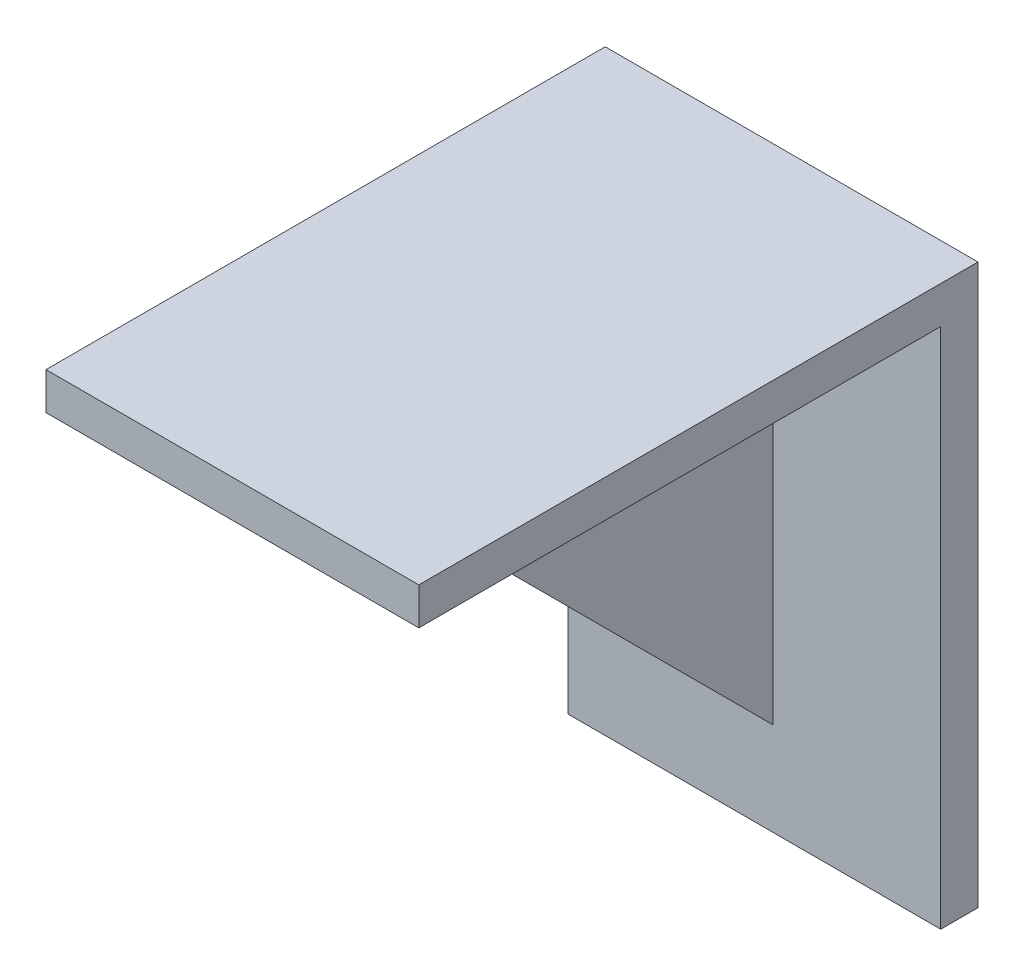
ISO-10303-21;
HEADER;
FILE_DESCRIPTION(('STEP AP214'),'2;1');
FILE_NAME('part.step','',(''),(''),'','','');
FILE_SCHEMA(('AUTOMOTIVE_DESIGN { 1 0 10303 214 1 1 1 1 }'));
ENDSEC;
DATA;
#1=APPLICATION_CONTEXT('core data for automotive mechanical design processes');
#2=APPLICATION_PROTOCOL_DEFINITION('international standard','automotive_design',2000,#1);
#3=PRODUCT_CONTEXT('',#1,'mechanical');
#4=PRODUCT('Part','Part','',(#3));
#5=PRODUCT_RELATED_PRODUCT_CATEGORY('part','',(#4));
#6=PRODUCT_DEFINITION_FORMATION('','',#4);
#7=PRODUCT_DEFINITION_CONTEXT('part definition',#1,'design');
#8=PRODUCT_DEFINITION('design','',#6,#7);
#9=PRODUCT_DEFINITION_SHAPE('','',#8);
#10=(LENGTH_UNIT() NAMED_UNIT(*) SI_UNIT(.MILLI.,.METRE.));
#11=(NAMED_UNIT(*) PLANE_ANGLE_UNIT() SI_UNIT($,.RADIAN.));
#12=(NAMED_UNIT(*) SI_UNIT($,.STERADIAN.) SOLID_ANGLE_UNIT());
#13=UNCERTAINTY_MEASURE_WITH_UNIT(LENGTH_MEASURE(1.E-05),#10,'distance_accuracy_value','');
#14=(GEOMETRIC_REPRESENTATION_CONTEXT(3) GLOBAL_UNCERTAINTY_ASSIGNED_CONTEXT((#13)) GLOBAL_UNIT_ASSIGNED_CONTEXT((#10,
#11,#12)) REPRESENTATION_CONTEXT('',''));
#15=CARTESIAN_POINT('',(0.,0.,0.));
#16=DIRECTION('',(0.,0.,1.));
#17=DIRECTION('',(1.,0.,0.));
#18=AXIS2_PLACEMENT_3D('',#15,#16,#17);
#19=CARTESIAN_POINT('',(100.,82.5,-82.5));
#20=DIRECTION('',(0.,0.707106781186547,-0.707106781186548));
#21=DIRECTION('',(0.,0.707106781186548,0.707106781186547));
#22=AXIS2_PLACEMENT_3D('',#19,#20,#21);
#23=PLANE('',#22);
#24=DIRECTION('',(0.,0.707106781186548,0.707106781186547));
#25=VECTOR('',#24,1.);
#26=CARTESIAN_POINT('',(55.,82.5,-82.5));
#27=LINE('',#26,#25);
#28=CARTESIAN_POINT('',(55.,25.,-140.));
#29=VERTEX_POINT('',#28);
#30=CARTESIAN_POINT('',(55.,140.,-25.));
#31=VERTEX_POINT('',#30);
#32=EDGE_CURVE('E56',#29,#31,#27,.T.);
#33=ORIENTED_EDGE('',*,*,#32,.T.);
#34=DIRECTION('',(-1.,0.,0.));
#35=VECTOR('',#34,1.);
#36=CARTESIAN_POINT('',(100.,140.,-25.));
#37=LINE('',#36,#35);
#38=CARTESIAN_POINT('',(45.,140.,-25.));
#39=VERTEX_POINT('',#38);
#40=EDGE_CURVE('E123',#31,#39,#37,.T.);
#41=ORIENTED_EDGE('',*,*,#40,.T.);
#42=DIRECTION('',(0.,0.707106781186548,0.707106781186547));
#43=VECTOR('',#42,1.);
#44=CARTESIAN_POINT('',(45.,82.5,-82.5));
#45=LINE('',#44,#43);
#46=CARTESIAN_POINT('',(45.,25.,-140.));
#47=VERTEX_POINT('',#46);
#48=EDGE_CURVE('E204',#47,#39,#45,.T.);
#49=ORIENTED_EDGE('',*,*,#48,.F.);
#50=DIRECTION('',(-1.,0.,0.));
#51=VECTOR('',#50,1.);
#52=CARTESIAN_POINT('',(100.,25.,-140.));
#53=LINE('',#52,#51);
#54=EDGE_CURVE('E125',#29,#47,#53,.T.);
#55=ORIENTED_EDGE('',*,*,#54,.F.);
#56=EDGE_LOOP('',(#33,#41,#49,#55));
#57=FACE_BOUND('',#56,.T.);
#58=ADVANCED_FACE('F40',(#57),#23,.F.);
#59=CARTESIAN_POINT('',(100.,150.,0.));
#60=DIRECTION('',(-1.,0.,0.));
#61=DIRECTION('',(0.,0.,1.));
#62=AXIS2_PLACEMENT_3D('',#59,#60,#61);
#63=PLANE('',#62);
#64=DIRECTION('',(0.,0.,1.));
#65=VECTOR('',#64,1.);
#66=CARTESIAN_POINT('',(100.,140.,0.));
#67=LINE('',#66,#65);
#68=CARTESIAN_POINT('',(100.,140.,-140.));
#69=VERTEX_POINT('',#68);
#70=CARTESIAN_POINT('',(100.,140.,0.));
#71=VERTEX_POINT('',#70);
#72=EDGE_CURVE('E152',#69,#71,#67,.T.);
#73=ORIENTED_EDGE('',*,*,#72,.F.);
#74=DIRECTION('',(0.,-1.,0.));
#75=VECTOR('',#74,1.);
#76=CARTESIAN_POINT('',(100.,0.,-140.));
#77=LINE('',#76,#75);
#78=CARTESIAN_POINT('',(100.,0.,-140.));
#79=VERTEX_POINT('',#78);
#80=EDGE_CURVE('E196',#69,#79,#77,.T.);
#81=ORIENTED_EDGE('',*,*,#80,.T.);
#82=DIRECTION('',(0.,0.,-1.));
#83=VECTOR('',#82,1.);
#84=CARTESIAN_POINT('',(100.,0.,0.));
#85=LINE('',#84,#83);
#86=CARTESIAN_POINT('',(100.,0.,-150.));
#87=VERTEX_POINT('',#86);
#88=EDGE_CURVE('E140',#79,#87,#85,.T.);
#89=ORIENTED_EDGE('',*,*,#88,.T.);
#90=DIRECTION('',(0.,-1.,0.));
#91=VECTOR('',#90,1.);
#92=CARTESIAN_POINT('',(100.,150.,-150.));
#93=LINE('',#92,#91);
#94=CARTESIAN_POINT('',(100.,150.,-150.));
#95=VERTEX_POINT('',#94);
#96=EDGE_CURVE('E175',#95,#87,#93,.T.);
#97=ORIENTED_EDGE('',*,*,#96,.F.);
#98=DIRECTION('',(0.,0.,-1.));
#99=VECTOR('',#98,1.);
#100=CARTESIAN_POINT('',(100.,150.,0.));
#101=LINE('',#100,#99);
#102=CARTESIAN_POINT('',(100.,150.,0.));
#103=VERTEX_POINT('',#102);
#104=EDGE_CURVE('E161',#103,#95,#101,.T.);
#105=ORIENTED_EDGE('',*,*,#104,.F.);
#106=DIRECTION('',(0.,-1.,0.));
#107=VECTOR('',#106,1.);
#108=CARTESIAN_POINT('',(100.,150.,0.));
#109=LINE('',#108,#107);
#110=EDGE_CURVE('E49',#103,#71,#109,.T.);
#111=ORIENTED_EDGE('',*,*,#110,.T.);
#112=EDGE_LOOP('',(#73,#81,#89,#97,#105,#111));
#113=FACE_BOUND('',#112,.T.);
#114=ADVANCED_FACE('F184',(#113),#63,.F.);
#115=CARTESIAN_POINT('',(0.,150.,-150.));
#116=DIRECTION('',(1.,0.,0.));
#117=DIRECTION('',(0.,0.,-1.));
#118=AXIS2_PLACEMENT_3D('',#115,#116,#117);
#119=PLANE('',#118);
#120=DIRECTION('',(0.,-1.,0.));
#121=VECTOR('',#120,1.);
#122=CARTESIAN_POINT('',(0.,0.,-140.));
#123=LINE('',#122,#121);
#124=CARTESIAN_POINT('',(0.,140.,-140.));
#125=VERTEX_POINT('',#124);
#126=CARTESIAN_POINT('',(0.,0.,-140.));
#127=VERTEX_POINT('',#126);
#128=EDGE_CURVE('E64',#125,#127,#123,.T.);
#129=ORIENTED_EDGE('',*,*,#128,.F.);
#130=DIRECTION('',(0.,0.,1.));
#131=VECTOR('',#130,1.);
#132=CARTESIAN_POINT('',(0.,140.,0.));
#133=LINE('',#132,#131);
#134=CARTESIAN_POINT('',(0.,140.,0.));
#135=VERTEX_POINT('',#134);
#136=EDGE_CURVE('E145',#125,#135,#133,.T.);
#137=ORIENTED_EDGE('',*,*,#136,.T.);
#138=DIRECTION('',(0.,-1.,0.));
#139=VECTOR('',#138,1.);
#140=CARTESIAN_POINT('',(0.,150.,0.));
#141=LINE('',#140,#139);
#142=CARTESIAN_POINT('',(0.,150.,0.));
#143=VERTEX_POINT('',#142);
#144=EDGE_CURVE('E11',#143,#135,#141,.T.);
#145=ORIENTED_EDGE('',*,*,#144,.F.);
#146=DIRECTION('',(0.,0.,1.));
#147=VECTOR('',#146,1.);
#148=CARTESIAN_POINT('',(0.,150.,-150.));
#149=LINE('',#148,#147);
#150=CARTESIAN_POINT('',(0.,150.,-150.));
#151=VERTEX_POINT('',#150);
#152=EDGE_CURVE('E153',#151,#143,#149,.T.);
#153=ORIENTED_EDGE('',*,*,#152,.F.);
#154=DIRECTION('',(0.,-1.,0.));
#155=VECTOR('',#154,1.);
#156=CARTESIAN_POINT('',(0.,150.,-150.));
#157=LINE('',#156,#155);
#158=CARTESIAN_POINT('',(0.,0.,-150.));
#159=VERTEX_POINT('',#158);
#160=EDGE_CURVE('E166',#151,#159,#157,.T.);
#161=ORIENTED_EDGE('',*,*,#160,.T.);
#162=DIRECTION('',(0.,0.,1.));
#163=VECTOR('',#162,1.);
#164=CARTESIAN_POINT('',(0.,0.,-150.));
#165=LINE('',#164,#163);
#166=EDGE_CURVE('E133',#159,#127,#165,.T.);
#167=ORIENTED_EDGE('',*,*,#166,.T.);
#168=EDGE_LOOP('',(#129,#137,#145,#153,#161,#167));
#169=FACE_BOUND('',#168,.T.);
#170=ADVANCED_FACE('F42',(#169),#119,.F.);
#171=CARTESIAN_POINT('',(0.,150.,0.));
#172=DIRECTION('',(0.,0.,-1.));
#173=DIRECTION('',(-1.,0.,0.));
#174=AXIS2_PLACEMENT_3D('',#171,#172,#173);
#175=PLANE('',#174);
#176=DIRECTION('',(-1.,0.,0.));
#177=VECTOR('',#176,1.);
#178=CARTESIAN_POINT('',(100.,140.,0.));
#179=LINE('',#178,#177);
#180=EDGE_CURVE('E134',#71,#135,#179,.T.);
#181=ORIENTED_EDGE('',*,*,#180,.F.);
#182=ORIENTED_EDGE('',*,*,#110,.F.);
#183=DIRECTION('',(1.,0.,0.));
#184=VECTOR('',#183,1.);
#185=CARTESIAN_POINT('',(0.,150.,0.));
#186=LINE('',#185,#184);
#187=EDGE_CURVE('E157',#143,#103,#186,.T.);
#188=ORIENTED_EDGE('',*,*,#187,.F.);
#189=ORIENTED_EDGE('',*,*,#144,.T.);
#190=EDGE_LOOP('',(#181,#182,#188,#189));
#191=FACE_BOUND('',#190,.T.);
#192=ADVANCED_FACE('F190',(#191),#175,.F.);
#193=CARTESIAN_POINT('',(100.,150.,-150.));
#194=DIRECTION('',(0.,0.,1.));
#195=DIRECTION('',(1.,0.,0.));
#196=AXIS2_PLACEMENT_3D('',#193,#194,#195);
#197=PLANE('',#196);
#198=DIRECTION('',(-1.,0.,0.));
#199=VECTOR('',#198,1.);
#200=CARTESIAN_POINT('',(100.,0.,-150.));
#201=LINE('',#200,#199);
#202=EDGE_CURVE('E158',#87,#159,#201,.T.);
#203=ORIENTED_EDGE('',*,*,#202,.T.);
#204=ORIENTED_EDGE('',*,*,#160,.F.);
#205=DIRECTION('',(-1.,0.,0.));
#206=VECTOR('',#205,1.);
#207=CARTESIAN_POINT('',(100.,150.,-150.));
#208=LINE('',#207,#206);
#209=EDGE_CURVE('E164',#95,#151,#208,.T.);
#210=ORIENTED_EDGE('',*,*,#209,.F.);
#211=ORIENTED_EDGE('',*,*,#96,.T.);
#212=EDGE_LOOP('',(#203,#204,#210,#211));
#213=FACE_BOUND('',#212,.T.);
#214=ADVANCED_FACE('F231',(#213),#197,.F.);
#215=CARTESIAN_POINT('',(0.,150.,0.));
#216=DIRECTION('',(0.,1.,0.));
#217=DIRECTION('',(0.,0.,1.));
#218=AXIS2_PLACEMENT_3D('',#215,#216,#217);
#219=PLANE('',#218);
#220=ORIENTED_EDGE('',*,*,#152,.T.);
#221=ORIENTED_EDGE('',*,*,#187,.T.);
#222=ORIENTED_EDGE('',*,*,#104,.T.);
#223=ORIENTED_EDGE('',*,*,#209,.T.);
#224=EDGE_LOOP('',(#220,#221,#222,#223));
#225=FACE_BOUND('',#224,.T.);
#226=ADVANCED_FACE('F234',(#225),#219,.T.);
#227=CARTESIAN_POINT('',(0.,0.,0.));
#228=DIRECTION('',(0.,1.,0.));
#229=DIRECTION('',(0.,0.,1.));
#230=AXIS2_PLACEMENT_3D('',#227,#228,#229);
#231=PLANE('',#230);
#232=ORIENTED_EDGE('',*,*,#88,.F.);
#233=DIRECTION('',(-1.,0.,0.));
#234=VECTOR('',#233,1.);
#235=CARTESIAN_POINT('',(100.,0.,-140.));
#236=LINE('',#235,#234);
#237=EDGE_CURVE('E142',#79,#127,#236,.T.);
#238=ORIENTED_EDGE('',*,*,#237,.T.);
#239=ORIENTED_EDGE('',*,*,#166,.F.);
#240=ORIENTED_EDGE('',*,*,#202,.F.);
#241=EDGE_LOOP('',(#232,#238,#239,#240));
#242=FACE_BOUND('',#241,.T.);
#243=ADVANCED_FACE('F227',(#242),#231,.F.);
#244=CARTESIAN_POINT('',(100.,140.,0.));
#245=DIRECTION('',(0.,-1.,0.));
#246=DIRECTION('',(0.,0.,-1.));
#247=AXIS2_PLACEMENT_3D('',#244,#245,#246);
#248=PLANE('',#247);
#249=ORIENTED_EDGE('',*,*,#136,.F.);
#250=DIRECTION('',(-1.,0.,0.));
#251=VECTOR('',#250,1.);
#252=CARTESIAN_POINT('',(45.,140.,-140.));
#253=LINE('',#252,#251);
#254=CARTESIAN_POINT('',(45.,140.,-140.));
#255=VERTEX_POINT('',#254);
#256=EDGE_CURVE('E201',#255,#125,#253,.T.);
#257=ORIENTED_EDGE('',*,*,#256,.F.);
#258=DIRECTION('',(0.,0.,-1.));
#259=VECTOR('',#258,1.);
#260=CARTESIAN_POINT('',(45.,140.,0.));
#261=LINE('',#260,#259);
#262=EDGE_CURVE('E130',#39,#255,#261,.T.);
#263=ORIENTED_EDGE('',*,*,#262,.F.);
#264=ORIENTED_EDGE('',*,*,#40,.F.);
#265=DIRECTION('',(0.,0.,-1.));
#266=VECTOR('',#265,1.);
#267=CARTESIAN_POINT('',(55.,140.,0.));
#268=LINE('',#267,#266);
#269=CARTESIAN_POINT('',(55.,140.,-140.));
#270=VERTEX_POINT('',#269);
#271=EDGE_CURVE('E111',#31,#270,#268,.T.);
#272=ORIENTED_EDGE('',*,*,#271,.T.);
#273=DIRECTION('',(1.,0.,0.));
#274=VECTOR('',#273,1.);
#275=CARTESIAN_POINT('',(55.,140.,-140.));
#276=LINE('',#275,#274);
#277=EDGE_CURVE('E217',#270,#69,#276,.T.);
#278=ORIENTED_EDGE('',*,*,#277,.T.);
#279=ORIENTED_EDGE('',*,*,#72,.T.);
#280=ORIENTED_EDGE('',*,*,#180,.T.);
#281=EDGE_LOOP('',(#249,#257,#263,#264,#272,#278,#279,#280));
#282=FACE_BOUND('',#281,.T.);
#283=ADVANCED_FACE('F128',(#282),#248,.T.);
#284=CARTESIAN_POINT('',(100.,0.,-140.));
#285=DIRECTION('',(0.,0.,-1.));
#286=DIRECTION('',(-1.,0.,0.));
#287=AXIS2_PLACEMENT_3D('',#284,#285,#286);
#288=PLANE('',#287);
#289=ORIENTED_EDGE('',*,*,#128,.T.);
#290=ORIENTED_EDGE('',*,*,#237,.F.);
#291=ORIENTED_EDGE('',*,*,#80,.F.);
#292=ORIENTED_EDGE('',*,*,#277,.F.);
#293=DIRECTION('',(0.,-1.,0.));
#294=VECTOR('',#293,1.);
#295=CARTESIAN_POINT('',(55.,0.,-140.));
#296=LINE('',#295,#294);
#297=EDGE_CURVE('E113',#270,#29,#296,.T.);
#298=ORIENTED_EDGE('',*,*,#297,.T.);
#299=ORIENTED_EDGE('',*,*,#54,.T.);
#300=DIRECTION('',(0.,-1.,0.));
#301=VECTOR('',#300,1.);
#302=CARTESIAN_POINT('',(45.,0.,-140.));
#303=LINE('',#302,#301);
#304=EDGE_CURVE('E211',#255,#47,#303,.T.);
#305=ORIENTED_EDGE('',*,*,#304,.F.);
#306=ORIENTED_EDGE('',*,*,#256,.T.);
#307=EDGE_LOOP('',(#289,#290,#291,#292,#298,#299,#305,#306));
#308=FACE_BOUND('',#307,.T.);
#309=ADVANCED_FACE('F222',(#308),#288,.F.);
#310=CARTESIAN_POINT('',(45.,0.,0.));
#311=DIRECTION('',(-1.,0.,0.));
#312=DIRECTION('',(0.,0.,1.));
#313=AXIS2_PLACEMENT_3D('',#310,#311,#312);
#314=PLANE('',#313);
#315=ORIENTED_EDGE('',*,*,#262,.T.);
#316=ORIENTED_EDGE('',*,*,#304,.T.);
#317=ORIENTED_EDGE('',*,*,#48,.T.);
#318=EDGE_LOOP('',(#315,#316,#317));
#319=FACE_BOUND('',#318,.T.);
#320=ADVANCED_FACE('F252',(#319),#314,.T.);
#321=CARTESIAN_POINT('',(55.,0.,0.));
#322=DIRECTION('',(1.,0.,0.));
#323=DIRECTION('',(0.,0.,1.));
#324=AXIS2_PLACEMENT_3D('',#321,#322,#323);
#325=PLANE('',#324);
#326=ORIENTED_EDGE('',*,*,#271,.F.);
#327=ORIENTED_EDGE('',*,*,#32,.F.);
#328=ORIENTED_EDGE('',*,*,#297,.F.);
#329=EDGE_LOOP('',(#326,#327,#328));
#330=FACE_BOUND('',#329,.T.);
#331=ADVANCED_FACE('F112',(#330),#325,.T.);
#332=CLOSED_SHELL('',(#58,#114,#170,#192,#214,#226,#243,#283,#309,#320,#331));
#333=MANIFOLD_SOLID_BREP('B2',#332);
#334=ADVANCED_BREP_SHAPE_REPRESENTATION('',(#18,#333),#14);
#335=SHAPE_DEFINITION_REPRESENTATION(#9,#334);
ENDSEC;
END-ISO-10303-21;
